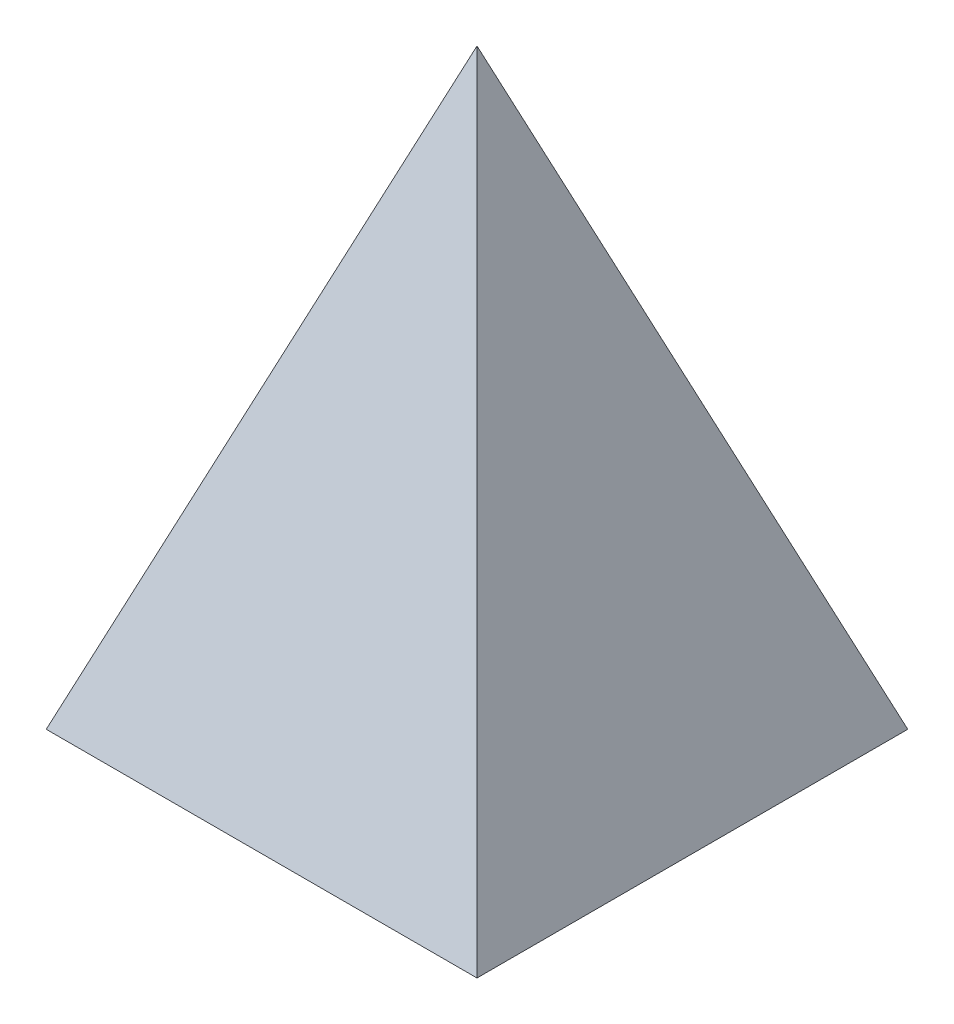
ISO-10303-21;
HEADER;
FILE_DESCRIPTION(('STEP AP214'),'2;1');
FILE_NAME('part.step','',(''),(''),'','','');
FILE_SCHEMA(('AUTOMOTIVE_DESIGN { 1 0 10303 214 1 1 1 1 }'));
ENDSEC;
DATA;
#1=APPLICATION_CONTEXT('core data for automotive mechanical design processes');
#2=APPLICATION_PROTOCOL_DEFINITION('international standard','automotive_design',2000,#1);
#3=PRODUCT_CONTEXT('',#1,'mechanical');
#4=PRODUCT('Part','Part','',(#3));
#5=PRODUCT_RELATED_PRODUCT_CATEGORY('part','',(#4));
#6=PRODUCT_DEFINITION_FORMATION('','',#4);
#7=PRODUCT_DEFINITION_CONTEXT('part definition',#1,'design');
#8=PRODUCT_DEFINITION('design','',#6,#7);
#9=PRODUCT_DEFINITION_SHAPE('','',#8);
#10=(LENGTH_UNIT() NAMED_UNIT(*) SI_UNIT(.MILLI.,.METRE.));
#11=(NAMED_UNIT(*) PLANE_ANGLE_UNIT() SI_UNIT($,.RADIAN.));
#12=(NAMED_UNIT(*) SI_UNIT($,.STERADIAN.) SOLID_ANGLE_UNIT());
#13=UNCERTAINTY_MEASURE_WITH_UNIT(LENGTH_MEASURE(1.E-05),#10,'distance_accuracy_value','');
#14=(GEOMETRIC_REPRESENTATION_CONTEXT(3) GLOBAL_UNCERTAINTY_ASSIGNED_CONTEXT((#13)) GLOBAL_UNIT_ASSIGNED_CONTEXT((#10,
#11,#12)) REPRESENTATION_CONTEXT('',''));
#15=CARTESIAN_POINT('',(0.,0.,0.));
#16=DIRECTION('',(0.,0.,1.));
#17=DIRECTION('',(1.,0.,0.));
#18=AXIS2_PLACEMENT_3D('',#15,#16,#17);
#19=CARTESIAN_POINT('',(-2.50000000000001,0.,-2.5));
#20=DIRECTION('',(-0.939692620785908,0.342020143325669,0.));
#21=DIRECTION('',(-0.342020143325669,-0.939692620785908,0.));
#22=AXIS2_PLACEMENT_3D('',#19,#20,#21);
#23=PLANE('',#22);
#24=DIRECTION('',(0.,0.,1.));
#25=VECTOR('',#24,1.);
#26=CARTESIAN_POINT('',(-2.50000000000001,0.,-2.5));
#27=LINE('',#26,#25);
#28=CARTESIAN_POINT('',(-2.50000000000001,0.,-2.5));
#29=VERTEX_POINT('',#28);
#30=CARTESIAN_POINT('',(-2.5,0.,2.5));
#31=VERTEX_POINT('',#30);
#32=EDGE_CURVE('E76',#29,#31,#27,.T.);
#33=ORIENTED_EDGE('',*,*,#32,.T.);
#34=DIRECTION('',(-0.323615577118185,-0.889126490715988,0.323615577118185));
#35=VECTOR('',#34,1.);
#36=CARTESIAN_POINT('',(-1.97636479123232,1.4386759121206,1.97636479123232));
#37=LINE('',#36,#35);
#38=CARTESIAN_POINT('',(0.,6.86869354863654,0.));
#39=VERTEX_POINT('',#38);
#40=EDGE_CURVE('E11',#39,#31,#37,.T.);
#41=ORIENTED_EDGE('',*,*,#40,.F.);
#42=DIRECTION('',(-0.323615577118186,-0.889126490715988,-0.323615577118185));
#43=VECTOR('',#42,1.);
#44=CARTESIAN_POINT('',(-2.50000000000001,0.,-2.5));
#45=LINE('',#44,#43);
#46=EDGE_CURVE('E61',#39,#29,#45,.T.);
#47=ORIENTED_EDGE('',*,*,#46,.T.);
#48=EDGE_LOOP('',(#33,#41,#47));
#49=FACE_BOUND('',#48,.T.);
#50=ADVANCED_FACE('F39',(#49),#23,.T.);
#51=CARTESIAN_POINT('',(2.49999999999999,0.,2.5));
#52=DIRECTION('',(0.,0.342020143325669,0.939692620785908));
#53=DIRECTION('',(0.,-0.939692620785908,0.342020143325669));
#54=AXIS2_PLACEMENT_3D('',#51,#52,#53);
#55=PLANE('',#54);
#56=DIRECTION('',(1.,0.,0.));
#57=VECTOR('',#56,1.);
#58=CARTESIAN_POINT('',(2.49999999999999,0.,2.5));
#59=LINE('',#58,#57);
#60=CARTESIAN_POINT('',(2.49999999999999,0.,2.5));
#61=VERTEX_POINT('',#60);
#62=EDGE_CURVE('E73',#31,#61,#59,.T.);
#63=ORIENTED_EDGE('',*,*,#62,.T.);
#64=DIRECTION('',(0.323615577118185,-0.889126490715988,0.323615577118185));
#65=VECTOR('',#64,1.);
#66=CARTESIAN_POINT('',(1.97636479123231,1.43867591212061,1.97636479123232));
#67=LINE('',#66,#65);
#68=EDGE_CURVE('E43',#39,#61,#67,.T.);
#69=ORIENTED_EDGE('',*,*,#68,.F.);
#70=ORIENTED_EDGE('',*,*,#40,.T.);
#71=EDGE_LOOP('',(#63,#69,#70));
#72=FACE_BOUND('',#71,.T.);
#73=ADVANCED_FACE('F41',(#72),#55,.T.);
#74=CARTESIAN_POINT('',(2.49999999999999,0.,-2.5));
#75=DIRECTION('',(0.939692620785908,0.342020143325669,0.));
#76=DIRECTION('',(-0.342020143325669,0.939692620785908,0.));
#77=AXIS2_PLACEMENT_3D('',#74,#75,#76);
#78=PLANE('',#77);
#79=DIRECTION('',(0.,0.,-1.));
#80=VECTOR('',#79,1.);
#81=CARTESIAN_POINT('',(2.49999999999999,0.,-2.5));
#82=LINE('',#81,#80);
#83=CARTESIAN_POINT('',(2.49999999999999,0.,-2.5));
#84=VERTEX_POINT('',#83);
#85=EDGE_CURVE('E78',#61,#84,#82,.T.);
#86=ORIENTED_EDGE('',*,*,#85,.T.);
#87=DIRECTION('',(0.323615577118185,-0.889126490715988,-0.323615577118185));
#88=VECTOR('',#87,1.);
#89=CARTESIAN_POINT('',(2.49999999999999,0.,-2.5));
#90=LINE('',#89,#88);
#91=EDGE_CURVE('E85',#39,#84,#90,.T.);
#92=ORIENTED_EDGE('',*,*,#91,.F.);
#93=ORIENTED_EDGE('',*,*,#68,.T.);
#94=EDGE_LOOP('',(#86,#92,#93));
#95=FACE_BOUND('',#94,.T.);
#96=ADVANCED_FACE('F88',(#95),#78,.T.);
#97=CARTESIAN_POINT('',(2.49999999999999,0.,-2.5));
#98=DIRECTION('',(0.,0.342020143325669,-0.939692620785908));
#99=DIRECTION('',(0.,0.939692620785908,0.342020143325669));
#100=AXIS2_PLACEMENT_3D('',#97,#98,#99);
#101=PLANE('',#100);
#102=DIRECTION('',(-1.,0.,0.));
#103=VECTOR('',#102,1.);
#104=CARTESIAN_POINT('',(2.49999999999999,0.,-2.5));
#105=LINE('',#104,#103);
#106=EDGE_CURVE('E83',#84,#29,#105,.T.);
#107=ORIENTED_EDGE('',*,*,#106,.T.);
#108=ORIENTED_EDGE('',*,*,#46,.F.);
#109=ORIENTED_EDGE('',*,*,#91,.T.);
#110=EDGE_LOOP('',(#107,#108,#109));
#111=FACE_BOUND('',#110,.T.);
#112=ADVANCED_FACE('F89',(#111),#101,.T.);
#113=CARTESIAN_POINT('',(0.,0.,0.));
#114=DIRECTION('',(0.,-1.,0.));
#115=DIRECTION('',(0.,0.,-1.));
#116=AXIS2_PLACEMENT_3D('',#113,#114,#115);
#117=PLANE('',#116);
#118=ORIENTED_EDGE('',*,*,#32,.F.);
#119=ORIENTED_EDGE('',*,*,#106,.F.);
#120=ORIENTED_EDGE('',*,*,#85,.F.);
#121=ORIENTED_EDGE('',*,*,#62,.F.);
#122=EDGE_LOOP('',(#118,#119,#120,#121));
#123=FACE_BOUND('',#122,.T.);
#124=ADVANCED_FACE('F74',(#123),#117,.T.);
#125=CLOSED_SHELL('',(#50,#73,#96,#112,#124));
#126=MANIFOLD_SOLID_BREP('B2',#125);
#127=ADVANCED_BREP_SHAPE_REPRESENTATION('',(#18,#126),#14);
#128=SHAPE_DEFINITION_REPRESENTATION(#9,#127);
ENDSEC;
END-ISO-10303-21;
